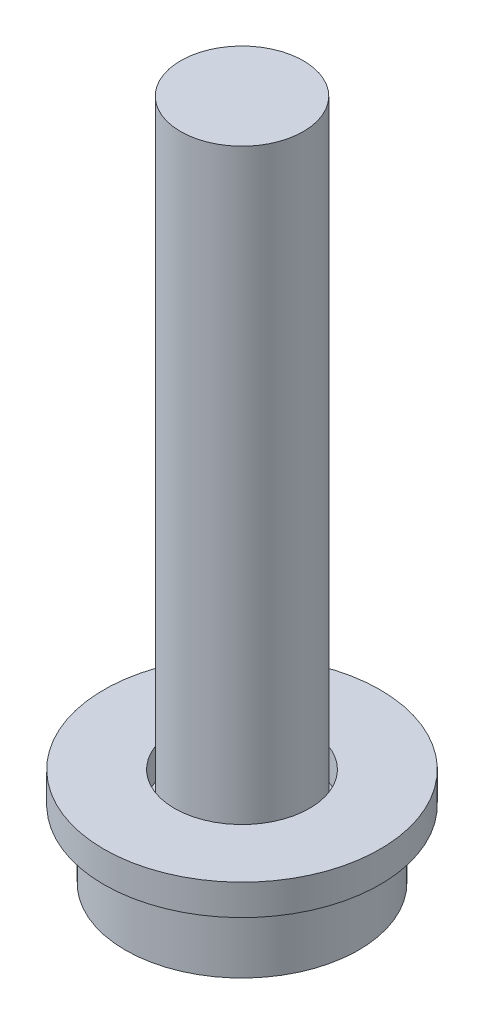
ISO-10303-21;
HEADER;
FILE_DESCRIPTION(('STEP AP214'),'2;1');
FILE_NAME('part.step','',(''),(''),'','','');
FILE_SCHEMA(('AUTOMOTIVE_DESIGN { 1 0 10303 214 1 1 1 1 }'));
ENDSEC;
DATA;
#1=APPLICATION_CONTEXT('core data for automotive mechanical design processes');
#2=APPLICATION_PROTOCOL_DEFINITION('international standard','automotive_design',2000,#1);
#3=PRODUCT_CONTEXT('',#1,'mechanical');
#4=PRODUCT('Part','Part','',(#3));
#5=PRODUCT_RELATED_PRODUCT_CATEGORY('part','',(#4));
#6=PRODUCT_DEFINITION_FORMATION('','',#4);
#7=PRODUCT_DEFINITION_CONTEXT('part definition',#1,'design');
#8=PRODUCT_DEFINITION('design','',#6,#7);
#9=PRODUCT_DEFINITION_SHAPE('','',#8);
#10=(LENGTH_UNIT() NAMED_UNIT(*) SI_UNIT(.MILLI.,.METRE.));
#11=(NAMED_UNIT(*) PLANE_ANGLE_UNIT() SI_UNIT($,.RADIAN.));
#12=(NAMED_UNIT(*) SI_UNIT($,.STERADIAN.) SOLID_ANGLE_UNIT());
#13=UNCERTAINTY_MEASURE_WITH_UNIT(LENGTH_MEASURE(1.E-05),#10,'distance_accuracy_value','');
#14=(GEOMETRIC_REPRESENTATION_CONTEXT(3) GLOBAL_UNCERTAINTY_ASSIGNED_CONTEXT((#13)) GLOBAL_UNIT_ASSIGNED_CONTEXT((#10,
#11,#12)) REPRESENTATION_CONTEXT('',''));
#15=CARTESIAN_POINT('',(0.,0.,0.));
#16=DIRECTION('',(0.,0.,1.));
#17=DIRECTION('',(1.,0.,0.));
#18=AXIS2_PLACEMENT_3D('',#15,#16,#17);
#19=CARTESIAN_POINT('',(0.,12.,0.));
#20=DIRECTION('',(0.,1.,0.));
#21=DIRECTION('',(1.,0.,0.));
#22=AXIS2_PLACEMENT_3D('',#19,#20,#21);
#23=PLANE('',#22);
#24=CARTESIAN_POINT('',(0.,12.,0.));
#25=DIRECTION('',(0.,1.,0.));
#26=DIRECTION('',(0.,0.,1.));
#27=AXIS2_PLACEMENT_3D('',#24,#25,#26);
#28=CIRCLE('',#27,2.);
#29=CARTESIAN_POINT('',(0.,12.,2.));
#30=VERTEX_POINT('',#29);
#31=EDGE_CURVE('E8',#30,#30,#28,.T.);
#32=ORIENTED_EDGE('',*,*,#31,.T.);
#33=EDGE_LOOP('',(#32));
#34=FACE_BOUND('',#33,.T.);
#35=ADVANCED_FACE('F13',(#34),#23,.T.);
#36=CARTESIAN_POINT('',(0.,-8.,0.));
#37=DIRECTION('',(0.,1.,0.));
#38=DIRECTION('',(0.,0.,1.));
#39=AXIS2_PLACEMENT_3D('',#36,#37,#38);
#40=CYLINDRICAL_SURFACE('',#39,2.);
#41=ORIENTED_EDGE('',*,*,#31,.F.);
#42=EDGE_LOOP('',(#41));
#43=FACE_BOUND('',#42,.T.);
#44=CARTESIAN_POINT('',(0.,-8.,0.));
#45=DIRECTION('',(0.,1.,0.));
#46=DIRECTION('',(0.,0.,1.));
#47=AXIS2_PLACEMENT_3D('',#44,#45,#46);
#48=CIRCLE('',#47,2.);
#49=CARTESIAN_POINT('',(0.,-8.,2.));
#50=VERTEX_POINT('',#49);
#51=EDGE_CURVE('E16',#50,#50,#48,.T.);
#52=ORIENTED_EDGE('',*,*,#51,.T.);
#53=EDGE_LOOP('',(#52));
#54=FACE_BOUND('',#53,.T.);
#55=ADVANCED_FACE('F47',(#43,#54),#40,.T.);
#56=CARTESIAN_POINT('',(0.,-10.2,0.));
#57=DIRECTION('',(0.,1.,0.));
#58=DIRECTION('',(1.,0.,0.));
#59=AXIS2_PLACEMENT_3D('',#56,#57,#58);
#60=PLANE('',#59);
#61=CARTESIAN_POINT('',(0.,-10.2,0.));
#62=DIRECTION('',(0.,1.,0.));
#63=DIRECTION('',(0.,0.,1.));
#64=AXIS2_PLACEMENT_3D('',#61,#62,#63);
#65=CIRCLE('',#64,3.8);
#66=CARTESIAN_POINT('',(0.,-10.2,3.8));
#67=VERTEX_POINT('',#66);
#68=EDGE_CURVE('E30',#67,#67,#65,.T.);
#69=ORIENTED_EDGE('',*,*,#68,.F.);
#70=EDGE_LOOP('',(#69));
#71=FACE_BOUND('',#70,.T.);
#72=ADVANCED_FACE('F44',(#71),#60,.F.);
#73=CARTESIAN_POINT('',(0.,-8.,0.));
#74=DIRECTION('',(0.,1.,0.));
#75=DIRECTION('',(1.,0.,0.));
#76=AXIS2_PLACEMENT_3D('',#73,#74,#75);
#77=PLANE('',#76);
#78=ORIENTED_EDGE('',*,*,#51,.F.);
#79=EDGE_LOOP('',(#78));
#80=FACE_BOUND('',#79,.T.);
#81=CARTESIAN_POINT('',(0.,-8.,0.));
#82=DIRECTION('',(0.,1.,0.));
#83=DIRECTION('',(0.,0.,1.));
#84=AXIS2_PLACEMENT_3D('',#81,#82,#83);
#85=CIRCLE('',#84,2.2);
#86=CARTESIAN_POINT('',(0.,-8.,2.2));
#87=VERTEX_POINT('',#86);
#88=EDGE_CURVE('E35',#87,#87,#85,.T.);
#89=ORIENTED_EDGE('',*,*,#88,.T.);
#90=EDGE_LOOP('',(#89));
#91=FACE_BOUND('',#90,.T.);
#92=ADVANCED_FACE('F46',(#80,#91),#77,.T.);
#93=CARTESIAN_POINT('',(0.,-10.2,0.));
#94=DIRECTION('',(0.,1.,0.));
#95=DIRECTION('',(0.,0.,1.));
#96=AXIS2_PLACEMENT_3D('',#93,#94,#95);
#97=CYLINDRICAL_SURFACE('',#96,3.8);
#98=CARTESIAN_POINT('',(0.,-8.,0.));
#99=DIRECTION('',(0.,1.,0.));
#100=DIRECTION('',(0.,0.,1.));
#101=AXIS2_PLACEMENT_3D('',#98,#99,#100);
#102=CIRCLE('',#101,3.8);
#103=CARTESIAN_POINT('',(0.,-8.,3.8));
#104=VERTEX_POINT('',#103);
#105=EDGE_CURVE('E33',#104,#104,#102,.T.);
#106=ORIENTED_EDGE('',*,*,#105,.F.);
#107=EDGE_LOOP('',(#106));
#108=FACE_BOUND('',#107,.T.);
#109=ORIENTED_EDGE('',*,*,#68,.T.);
#110=EDGE_LOOP('',(#109));
#111=FACE_BOUND('',#110,.T.);
#112=ADVANCED_FACE('F42',(#108,#111),#97,.T.);
#113=CARTESIAN_POINT('',(0.,-8.1,0.));
#114=DIRECTION('',(0.,1.,0.));
#115=DIRECTION('',(0.,0.,1.));
#116=AXIS2_PLACEMENT_3D('',#113,#114,#115);
#117=CYLINDRICAL_SURFACE('',#116,2.2);
#118=CARTESIAN_POINT('',(0.,-7.,0.));
#119=DIRECTION('',(0.,1.,0.));
#120=DIRECTION('',(0.,0.,1.));
#121=AXIS2_PLACEMENT_3D('',#118,#119,#120);
#122=CIRCLE('',#121,2.2);
#123=CARTESIAN_POINT('',(0.,-7.,2.2));
#124=VERTEX_POINT('',#123);
#125=EDGE_CURVE('E145',#124,#124,#122,.T.);
#126=ORIENTED_EDGE('',*,*,#125,.T.);
#127=EDGE_LOOP('',(#126));
#128=FACE_BOUND('',#127,.T.);
#129=ORIENTED_EDGE('',*,*,#88,.F.);
#130=EDGE_LOOP('',(#129));
#131=FACE_BOUND('',#130,.T.);
#132=ADVANCED_FACE('F90',(#128,#131),#117,.F.);
#133=CARTESIAN_POINT('',(0.,-8.,0.));
#134=DIRECTION('',(0.,1.,0.));
#135=DIRECTION('',(1.,0.,0.));
#136=AXIS2_PLACEMENT_3D('',#133,#134,#135);
#137=PLANE('',#136);
#138=ORIENTED_EDGE('',*,*,#105,.T.);
#139=EDGE_LOOP('',(#138));
#140=FACE_BOUND('',#139,.T.);
#141=CARTESIAN_POINT('',(0.,-8.,0.));
#142=DIRECTION('',(0.,1.,0.));
#143=DIRECTION('',(0.,0.,1.));
#144=AXIS2_PLACEMENT_3D('',#141,#142,#143);
#145=CIRCLE('',#144,4.5);
#146=CARTESIAN_POINT('',(0.,-8.,4.5));
#147=VERTEX_POINT('',#146);
#148=EDGE_CURVE('E142',#147,#147,#145,.T.);
#149=ORIENTED_EDGE('',*,*,#148,.F.);
#150=EDGE_LOOP('',(#149));
#151=FACE_BOUND('',#150,.T.);
#152=ADVANCED_FACE('F101',(#140,#151),#137,.F.);
#153=CARTESIAN_POINT('',(0.,-7.,0.));
#154=DIRECTION('',(0.,1.,0.));
#155=DIRECTION('',(1.,0.,0.));
#156=AXIS2_PLACEMENT_3D('',#153,#154,#155);
#157=PLANE('',#156);
#158=ORIENTED_EDGE('',*,*,#125,.F.);
#159=EDGE_LOOP('',(#158));
#160=FACE_BOUND('',#159,.T.);
#161=CARTESIAN_POINT('',(0.,-7.,0.));
#162=DIRECTION('',(0.,1.,0.));
#163=DIRECTION('',(0.,0.,1.));
#164=AXIS2_PLACEMENT_3D('',#161,#162,#163);
#165=CIRCLE('',#164,4.5);
#166=CARTESIAN_POINT('',(0.,-7.,4.5));
#167=VERTEX_POINT('',#166);
#168=EDGE_CURVE('E139',#167,#167,#165,.T.);
#169=ORIENTED_EDGE('',*,*,#168,.T.);
#170=EDGE_LOOP('',(#169));
#171=FACE_BOUND('',#170,.T.);
#172=ADVANCED_FACE('F111',(#160,#171),#157,.T.);
#173=CARTESIAN_POINT('',(0.,-8.,0.));
#174=DIRECTION('',(0.,1.,0.));
#175=DIRECTION('',(0.,0.,1.));
#176=AXIS2_PLACEMENT_3D('',#173,#174,#175);
#177=CYLINDRICAL_SURFACE('',#176,4.5);
#178=ORIENTED_EDGE('',*,*,#168,.F.);
#179=EDGE_LOOP('',(#178));
#180=FACE_BOUND('',#179,.T.);
#181=ORIENTED_EDGE('',*,*,#148,.T.);
#182=EDGE_LOOP('',(#181));
#183=FACE_BOUND('',#182,.T.);
#184=ADVANCED_FACE('F120',(#180,#183),#177,.T.);
#185=CLOSED_SHELL('',(#35,#55,#72,#92,#112,#132,#152,#172,#184));
#186=MANIFOLD_SOLID_BREP('B1',#185);
#187=ADVANCED_BREP_SHAPE_REPRESENTATION('',(#18,#186),#14);
#188=SHAPE_DEFINITION_REPRESENTATION(#9,#187);
ENDSEC;
END-ISO-10303-21;
